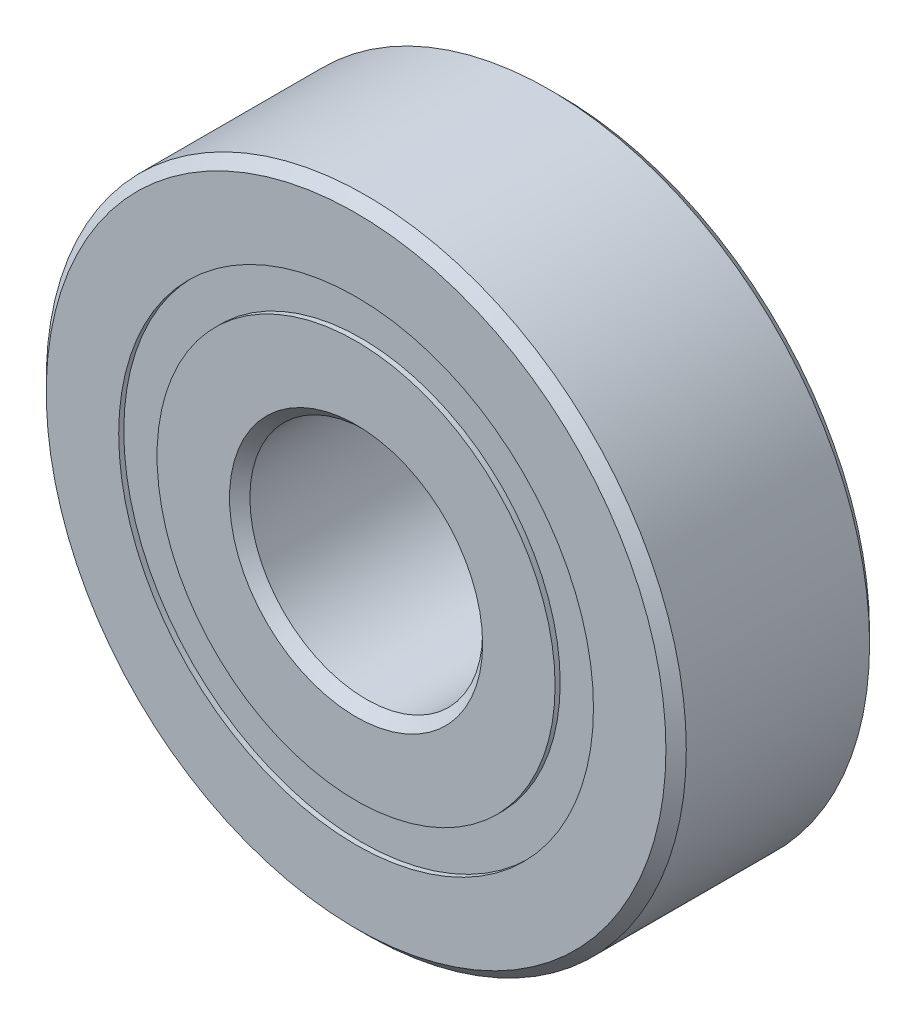
ISO-10303-21;
HEADER;
FILE_DESCRIPTION(('STEP AP214'),'2;1');
FILE_NAME('part.step','',(''),(''),'','','');
FILE_SCHEMA(('AUTOMOTIVE_DESIGN { 1 0 10303 214 1 1 1 1 }'));
ENDSEC;
DATA;
#1=APPLICATION_CONTEXT('core data for automotive mechanical design processes');
#2=APPLICATION_PROTOCOL_DEFINITION('international standard','automotive_design',2000,#1);
#3=PRODUCT_CONTEXT('',#1,'mechanical');
#4=PRODUCT('Part','Part','',(#3));
#5=PRODUCT_RELATED_PRODUCT_CATEGORY('part','',(#4));
#6=PRODUCT_DEFINITION_FORMATION('','',#4);
#7=PRODUCT_DEFINITION_CONTEXT('part definition',#1,'design');
#8=PRODUCT_DEFINITION('design','',#6,#7);
#9=PRODUCT_DEFINITION_SHAPE('','',#8);
#10=(LENGTH_UNIT() NAMED_UNIT(*) SI_UNIT(.MILLI.,.METRE.));
#11=(NAMED_UNIT(*) PLANE_ANGLE_UNIT() SI_UNIT($,.RADIAN.));
#12=(NAMED_UNIT(*) SI_UNIT($,.STERADIAN.) SOLID_ANGLE_UNIT());
#13=UNCERTAINTY_MEASURE_WITH_UNIT(LENGTH_MEASURE(1.E-05),#10,'distance_accuracy_value','');
#14=(GEOMETRIC_REPRESENTATION_CONTEXT(3) GLOBAL_UNCERTAINTY_ASSIGNED_CONTEXT((#13)) GLOBAL_UNIT_ASSIGNED_CONTEXT((#10,
#11,#12)) REPRESENTATION_CONTEXT('',''));
#15=CARTESIAN_POINT('',(0.,0.,0.));
#16=DIRECTION('',(0.,0.,1.));
#17=DIRECTION('',(1.,0.,0.));
#18=AXIS2_PLACEMENT_3D('',#15,#16,#17);
#19=CARTESIAN_POINT('',(0.,8.15934065934065,-3.32500000000002));
#20=DIRECTION('',(0.,0.,1.));
#21=DIRECTION('',(1.,0.,0.));
#22=AXIS2_PLACEMENT_3D('',#19,#20,#21);
#23=PLANE('',#22);
#24=CARTESIAN_POINT('',(0.,0.,-3.32500000000008));
#25=DIRECTION('',(0.,0.,1.));
#26=DIRECTION('',(1.,0.,0.));
#27=AXIS2_PLACEMENT_3D('',#24,#25,#26);
#28=CIRCLE('',#27,8.15934065934066);
#29=CARTESIAN_POINT('',(8.15934065934063,0.,-3.32500000000008));
#30=VERTEX_POINT('',#29);
#31=EDGE_CURVE('E57',#30,#30,#28,.T.);
#32=ORIENTED_EDGE('',*,*,#31,.F.);
#33=EDGE_LOOP('',(#32));
#34=FACE_BOUND('',#33,.T.);
#35=CARTESIAN_POINT('',(0.,0.,-3.32500000000008));
#36=DIRECTION('',(0.,0.,1.));
#37=DIRECTION('',(1.,0.,0.));
#38=AXIS2_PLACEMENT_3D('',#35,#36,#37);
#39=CIRCLE('',#38,6.84065934065934);
#40=CARTESIAN_POINT('',(6.84065934065931,0.,-3.32500000000008));
#41=VERTEX_POINT('',#40);
#42=EDGE_CURVE('E11',#41,#41,#39,.T.);
#43=ORIENTED_EDGE('',*,*,#42,.T.);
#44=EDGE_LOOP('',(#43));
#45=FACE_BOUND('',#44,.T.);
#46=ADVANCED_FACE('F43',(#34,#45),#23,.F.);
#47=CARTESIAN_POINT('',(0.,0.,3.5));
#48=DIRECTION('',(0.,0.,1.));
#49=DIRECTION('',(1.,0.,0.));
#50=AXIS2_PLACEMENT_3D('',#47,#48,#49);
#51=CYLINDRICAL_SURFACE('',#50,6.84065934065934);
#52=ORIENTED_EDGE('',*,*,#42,.F.);
#53=EDGE_LOOP('',(#52));
#54=FACE_BOUND('',#53,.T.);
#55=CARTESIAN_POINT('',(0.,0.,-1.68952158656807));
#56=DIRECTION('',(0.,0.,1.));
#57=DIRECTION('',(1.,0.,0.));
#58=AXIS2_PLACEMENT_3D('',#55,#56,#57);
#59=CIRCLE('',#58,6.84065934065934);
#60=CARTESIAN_POINT('',(6.84065934065928,0.,-1.68952158656807));
#61=VERTEX_POINT('',#60);
#62=EDGE_CURVE('E49',#61,#61,#59,.T.);
#63=ORIENTED_EDGE('',*,*,#62,.T.);
#64=EDGE_LOOP('',(#63));
#65=FACE_BOUND('',#64,.T.);
#66=ADVANCED_FACE('F66',(#54,#65),#51,.F.);
#67=CARTESIAN_POINT('',(0.,8.15934065934065,-1.6895215865681));
#68=DIRECTION('',(0.,0.,-1.));
#69=DIRECTION('',(-1.,0.,0.));
#70=AXIS2_PLACEMENT_3D('',#67,#68,#69);
#71=PLANE('',#70);
#72=ORIENTED_EDGE('',*,*,#62,.F.);
#73=EDGE_LOOP('',(#72));
#74=FACE_BOUND('',#73,.T.);
#75=CARTESIAN_POINT('',(0.,0.,-1.68952158656807));
#76=DIRECTION('',(0.,0.,1.));
#77=DIRECTION('',(1.,0.,0.));
#78=AXIS2_PLACEMENT_3D('',#75,#76,#77);
#79=CIRCLE('',#78,8.15934065934066);
#80=CARTESIAN_POINT('',(8.1593406593406,0.,-1.68952158656807));
#81=VERTEX_POINT('',#80);
#82=EDGE_CURVE('E53',#81,#81,#79,.T.);
#83=ORIENTED_EDGE('',*,*,#82,.T.);
#84=EDGE_LOOP('',(#83));
#85=FACE_BOUND('',#84,.T.);
#86=ADVANCED_FACE('F70',(#74,#85),#71,.F.);
#87=CARTESIAN_POINT('',(0.,0.,3.5));
#88=DIRECTION('',(0.,0.,1.));
#89=DIRECTION('',(1.,0.,0.));
#90=AXIS2_PLACEMENT_3D('',#87,#88,#89);
#91=CYLINDRICAL_SURFACE('',#90,8.15934065934066);
#92=ORIENTED_EDGE('',*,*,#82,.F.);
#93=EDGE_LOOP('',(#92));
#94=FACE_BOUND('',#93,.T.);
#95=ORIENTED_EDGE('',*,*,#31,.T.);
#96=EDGE_LOOP('',(#95));
#97=FACE_BOUND('',#96,.T.);
#98=ADVANCED_FACE('F63',(#94,#97),#91,.T.);
#99=CLOSED_SHELL('',(#46,#66,#86,#98));
#100=MANIFOLD_SOLID_BREP('B2',#99);
#101=CARTESIAN_POINT('',(0.,8.15934065934065,3.32499999999999));
#102=DIRECTION('',(0.,0.,-1.));
#103=DIRECTION('',(-1.,0.,0.));
#104=AXIS2_PLACEMENT_3D('',#101,#102,#103);
#105=PLANE('',#104);
#106=CARTESIAN_POINT('',(0.,0.,3.32499999999999));
#107=DIRECTION('',(0.,0.,1.));
#108=DIRECTION('',(1.,0.,0.));
#109=AXIS2_PLACEMENT_3D('',#106,#107,#108);
#110=CIRCLE('',#109,6.84065934065934);
#111=CARTESIAN_POINT('',(6.84065934065934,0.,3.32499999999999));
#112=VERTEX_POINT('',#111);
#113=EDGE_CURVE('E42',#112,#112,#110,.T.);
#114=ORIENTED_EDGE('',*,*,#113,.F.);
#115=EDGE_LOOP('',(#114));
#116=FACE_BOUND('',#115,.T.);
#117=CARTESIAN_POINT('',(0.,0.,3.32499999999999));
#118=DIRECTION('',(0.,0.,1.));
#119=DIRECTION('',(1.,0.,0.));
#120=AXIS2_PLACEMENT_3D('',#117,#118,#119);
#121=CIRCLE('',#120,8.15934065934066);
#122=CARTESIAN_POINT('',(8.15934065934066,0.,3.32499999999999));
#123=VERTEX_POINT('',#122);
#124=EDGE_CURVE('E124',#123,#123,#121,.T.);
#125=ORIENTED_EDGE('',*,*,#124,.T.);
#126=EDGE_LOOP('',(#125));
#127=FACE_BOUND('',#126,.T.);
#128=ADVANCED_FACE('F110',(#116,#127),#105,.F.);
#129=CARTESIAN_POINT('',(0.,0.,3.5));
#130=DIRECTION('',(0.,0.,1.));
#131=DIRECTION('',(1.,0.,0.));
#132=AXIS2_PLACEMENT_3D('',#129,#130,#131);
#133=CYLINDRICAL_SURFACE('',#132,6.84065934065934);
#134=CARTESIAN_POINT('',(0.,0.,1.68952158656807));
#135=DIRECTION('',(0.,0.,1.));
#136=DIRECTION('',(1.,0.,0.));
#137=AXIS2_PLACEMENT_3D('',#134,#135,#136);
#138=CIRCLE('',#137,6.84065934065934);
#139=CARTESIAN_POINT('',(6.84065934065934,0.,1.68952158656807));
#140=VERTEX_POINT('',#139);
#141=EDGE_CURVE('E116',#140,#140,#138,.T.);
#142=ORIENTED_EDGE('',*,*,#141,.F.);
#143=EDGE_LOOP('',(#142));
#144=FACE_BOUND('',#143,.T.);
#145=ORIENTED_EDGE('',*,*,#113,.T.);
#146=EDGE_LOOP('',(#145));
#147=FACE_BOUND('',#146,.T.);
#148=ADVANCED_FACE('F139',(#144,#147),#133,.F.);
#149=CARTESIAN_POINT('',(0.,8.15934065934065,1.68952158656807));
#150=DIRECTION('',(0.,0.,1.));
#151=DIRECTION('',(1.,0.,0.));
#152=AXIS2_PLACEMENT_3D('',#149,#150,#151);
#153=PLANE('',#152);
#154=CARTESIAN_POINT('',(0.,0.,1.68952158656807));
#155=DIRECTION('',(0.,0.,1.));
#156=DIRECTION('',(1.,0.,0.));
#157=AXIS2_PLACEMENT_3D('',#154,#155,#156);
#158=CIRCLE('',#157,8.15934065934066);
#159=CARTESIAN_POINT('',(8.15934065934066,0.,1.68952158656807));
#160=VERTEX_POINT('',#159);
#161=EDGE_CURVE('E120',#160,#160,#158,.T.);
#162=ORIENTED_EDGE('',*,*,#161,.F.);
#163=EDGE_LOOP('',(#162));
#164=FACE_BOUND('',#163,.T.);
#165=ORIENTED_EDGE('',*,*,#141,.T.);
#166=EDGE_LOOP('',(#165));
#167=FACE_BOUND('',#166,.T.);
#168=ADVANCED_FACE('F134',(#164,#167),#153,.F.);
#169=CARTESIAN_POINT('',(0.,0.,3.5));
#170=DIRECTION('',(0.,0.,1.));
#171=DIRECTION('',(1.,0.,0.));
#172=AXIS2_PLACEMENT_3D('',#169,#170,#171);
#173=CYLINDRICAL_SURFACE('',#172,8.15934065934066);
#174=ORIENTED_EDGE('',*,*,#124,.F.);
#175=EDGE_LOOP('',(#174));
#176=FACE_BOUND('',#175,.T.);
#177=ORIENTED_EDGE('',*,*,#161,.T.);
#178=EDGE_LOOP('',(#177));
#179=FACE_BOUND('',#178,.T.);
#180=ADVANCED_FACE('F131',(#176,#179),#173,.T.);
#181=CLOSED_SHELL('',(#128,#148,#168,#180));
#182=MANIFOLD_SOLID_BREP('B6',#181);
#183=CARTESIAN_POINT('',(-3.74999999999989,6.49519052838332,0.));
#184=DIRECTION('',(0.,0.,1.));
#185=DIRECTION('',(-0.499999999999989,0.866025403784445,0.));
#186=AXIS2_PLACEMENT_3D('',#183,#184,#185);
#187=SPHERICAL_SURFACE('',#186,1.68952158656808);
#188=CARTESIAN_POINT('',(-3.74999999999989,6.49519052838332,1.68952158656805));
#189=VERTEX_POINT('',#188);
#190=VERTEX_LOOP('',#189);
#191=FACE_BOUND('',#190,.T.);
#192=ADVANCED_FACE('F177',(#191),#187,.T.);
#193=CLOSED_SHELL('',(#192));
#194=MANIFOLD_SOLID_BREP('B37',#193);
#195=CARTESIAN_POINT('',(-6.49519052838327,3.75000000000009,0.));
#196=DIRECTION('',(0.,0.,1.));
#197=DIRECTION('',(-0.866025403784433,0.50000000000001,0.));
#198=AXIS2_PLACEMENT_3D('',#195,#196,#197);
#199=SPHERICAL_SURFACE('',#198,1.68952158656808);
#200=CARTESIAN_POINT('',(-6.49519052838327,3.75000000000009,1.68952158656805));
#201=VERTEX_POINT('',#200);
#202=VERTEX_LOOP('',#201);
#203=FACE_BOUND('',#202,.T.);
#204=ADVANCED_FACE('F197',(#203),#199,.T.);
#205=CLOSED_SHELL('',(#204));
#206=MANIFOLD_SOLID_BREP('B106',#205);
#207=CARTESIAN_POINT('',(-7.50000000000003,1.11022302462516E-13,0.));
#208=DIRECTION('',(0.,0.,1.));
#209=DIRECTION('',(-1.,0.,0.));
#210=AXIS2_PLACEMENT_3D('',#207,#208,#209);
#211=SPHERICAL_SURFACE('',#210,1.68952158656808);
#212=CARTESIAN_POINT('',(-7.50000000000003,1.11022302462516E-13,1.68952158656805));
#213=VERTEX_POINT('',#212);
#214=VERTEX_LOOP('',#213);
#215=FACE_BOUND('',#214,.T.);
#216=ADVANCED_FACE('F217',(#215),#211,.T.);
#217=CLOSED_SHELL('',(#216));
#218=MANIFOLD_SOLID_BREP('B173',#217);
#219=CARTESIAN_POINT('',(-6.49519052838332,-3.74999999999992,0.));
#220=DIRECTION('',(0.,0.,1.));
#221=DIRECTION('',(-0.866025403784443,-0.499999999999992,0.));
#222=AXIS2_PLACEMENT_3D('',#219,#220,#221);
#223=SPHERICAL_SURFACE('',#222,1.68952158656808);
#224=CARTESIAN_POINT('',(-6.49519052838332,-3.74999999999992,1.68952158656808));
#225=VERTEX_POINT('',#224);
#226=VERTEX_LOOP('',#225);
#227=FACE_BOUND('',#226,.T.);
#228=ADVANCED_FACE('F237',(#227),#223,.T.);
#229=CLOSED_SHELL('',(#228));
#230=MANIFOLD_SOLID_BREP('B193',#229);
#231=CARTESIAN_POINT('',(-3.75000000000009,-6.49519052838321,0.));
#232=DIRECTION('',(0.,0.,1.));
#233=DIRECTION('',(-0.500000000000007,-0.866025403784435,0.));
#234=AXIS2_PLACEMENT_3D('',#231,#232,#233);
#235=SPHERICAL_SURFACE('',#234,1.68952158656808);
#236=CARTESIAN_POINT('',(-3.75000000000009,-6.49519052838321,1.68952158656808));
#237=VERTEX_POINT('',#236);
#238=VERTEX_LOOP('',#237);
#239=FACE_BOUND('',#238,.T.);
#240=ADVANCED_FACE('F257',(#239),#235,.T.);
#241=CLOSED_SHELL('',(#240));
#242=MANIFOLD_SOLID_BREP('B213',#241);
#243=CARTESIAN_POINT('',(0.,-7.50000000000001,0.));
#244=DIRECTION('',(0.,0.,1.));
#245=DIRECTION('',(0.,-1.,0.));
#246=AXIS2_PLACEMENT_3D('',#243,#244,#245);
#247=SPHERICAL_SURFACE('',#246,1.68952158656808);
#248=CARTESIAN_POINT('',(0.,-7.50000000000001,1.68952158656805));
#249=VERTEX_POINT('',#248);
#250=VERTEX_LOOP('',#249);
#251=FACE_BOUND('',#250,.T.);
#252=ADVANCED_FACE('F277',(#251),#247,.T.);
#253=CLOSED_SHELL('',(#252));
#254=MANIFOLD_SOLID_BREP('B233',#253);
#255=CARTESIAN_POINT('',(3.74999999999998,-6.49519052838332,0.));
#256=DIRECTION('',(0.,0.,1.));
#257=DIRECTION('',(0.499999999999995,-0.866025403784441,0.));
#258=AXIS2_PLACEMENT_3D('',#255,#256,#257);
#259=SPHERICAL_SURFACE('',#258,1.68952158656808);
#260=CARTESIAN_POINT('',(3.74999999999998,-6.49519052838332,1.68952158656805));
#261=VERTEX_POINT('',#260);
#262=VERTEX_LOOP('',#261);
#263=FACE_BOUND('',#262,.T.);
#264=ADVANCED_FACE('F297',(#263),#259,.T.);
#265=CLOSED_SHELL('',(#264));
#266=MANIFOLD_SOLID_BREP('B253',#265);
#267=CARTESIAN_POINT('',(6.49519052838327,-3.75000000000003,0.));
#268=DIRECTION('',(0.,0.,1.));
#269=DIRECTION('',(0.866025403784436,-0.500000000000004,0.));
#270=AXIS2_PLACEMENT_3D('',#267,#268,#269);
#271=SPHERICAL_SURFACE('',#270,1.68952158656808);
#272=CARTESIAN_POINT('',(6.49519052838327,-3.75000000000003,1.68952158656808));
#273=VERTEX_POINT('',#272);
#274=VERTEX_LOOP('',#273);
#275=FACE_BOUND('',#274,.T.);
#276=ADVANCED_FACE('F317',(#275),#271,.T.);
#277=CLOSED_SHELL('',(#276));
#278=MANIFOLD_SOLID_BREP('B273',#277);
#279=CARTESIAN_POINT('',(7.50000000000001,0.,0.));
#280=DIRECTION('',(0.,0.,1.));
#281=DIRECTION('',(1.,0.,0.));
#282=AXIS2_PLACEMENT_3D('',#279,#280,#281);
#283=SPHERICAL_SURFACE('',#282,1.68952158656808);
#284=CARTESIAN_POINT('',(7.50000000000001,0.,1.68952158656808));
#285=VERTEX_POINT('',#284);
#286=VERTEX_LOOP('',#285);
#287=FACE_BOUND('',#286,.T.);
#288=ADVANCED_FACE('F337',(#287),#283,.T.);
#289=CLOSED_SHELL('',(#288));
#290=MANIFOLD_SOLID_BREP('B293',#289);
#291=CARTESIAN_POINT('',(6.49519052838332,3.75000000000003,0.));
#292=DIRECTION('',(0.,0.,1.));
#293=DIRECTION('',(0.86602540378444,0.499999999999998,0.));
#294=AXIS2_PLACEMENT_3D('',#291,#292,#293);
#295=SPHERICAL_SURFACE('',#294,1.68952158656808);
#296=CARTESIAN_POINT('',(6.49519052838332,3.75000000000003,1.68952158656805));
#297=VERTEX_POINT('',#296);
#298=VERTEX_LOOP('',#297);
#299=FACE_BOUND('',#298,.T.);
#300=ADVANCED_FACE('F357',(#299),#295,.T.);
#301=CLOSED_SHELL('',(#300));
#302=MANIFOLD_SOLID_BREP('B313',#301);
#303=CARTESIAN_POINT('',(3.75000000000003,6.49519052838332,0.));
#304=DIRECTION('',(0.,0.,1.));
#305=DIRECTION('',(0.500000000000001,0.866025403784438,0.));
#306=AXIS2_PLACEMENT_3D('',#303,#304,#305);
#307=SPHERICAL_SURFACE('',#306,1.68952158656808);
#308=CARTESIAN_POINT('',(3.75000000000003,6.49519052838332,1.68952158656805));
#309=VERTEX_POINT('',#308);
#310=VERTEX_LOOP('',#309);
#311=FACE_BOUND('',#310,.T.);
#312=ADVANCED_FACE('F377',(#311),#307,.T.);
#313=CLOSED_SHELL('',(#312));
#314=MANIFOLD_SOLID_BREP('B333',#313);
#315=CARTESIAN_POINT('',(0.,7.50000000000001,0.));
#316=DIRECTION('',(0.,0.,1.));
#317=DIRECTION('',(0.,1.,0.));
#318=AXIS2_PLACEMENT_3D('',#315,#316,#317);
#319=SPHERICAL_SURFACE('',#318,1.68952158656808);
#320=CARTESIAN_POINT('',(0.,7.50000000000001,1.68952158656808));
#321=VERTEX_POINT('',#320);
#322=VERTEX_LOOP('',#321);
#323=FACE_BOUND('',#322,.T.);
#324=ADVANCED_FACE('F399',(#323),#319,.T.);
#325=CLOSED_SHELL('',(#324));
#326=MANIFOLD_SOLID_BREP('B353',#325);
#327=CARTESIAN_POINT('',(0.,6.84065934065936,3.49999999999998));
#328=DIRECTION('',(0.,0.,-1.));
#329=DIRECTION('',(-1.,0.,0.));
#330=AXIS2_PLACEMENT_3D('',#327,#328,#329);
#331=PLANE('',#330);
#332=CARTESIAN_POINT('',(0.,0.,3.5));
#333=DIRECTION('',(0.,0.,1.));
#334=DIRECTION('',(1.,0.,0.));
#335=AXIS2_PLACEMENT_3D('',#332,#333,#334);
#336=CIRCLE('',#335,4.35);
#337=CARTESIAN_POINT('',(4.35,0.,3.5));
#338=VERTEX_POINT('',#337);
#339=EDGE_CURVE('E446',#338,#338,#336,.T.);
#340=ORIENTED_EDGE('',*,*,#339,.F.);
#341=EDGE_LOOP('',(#340));
#342=FACE_BOUND('',#341,.T.);
#343=CARTESIAN_POINT('',(0.,0.,3.5));
#344=DIRECTION('',(0.,0.,1.));
#345=DIRECTION('',(1.,0.,0.));
#346=AXIS2_PLACEMENT_3D('',#343,#344,#345);
#347=CIRCLE('',#346,6.84065934065934);
#348=CARTESIAN_POINT('',(6.84065934065934,0.,3.5));
#349=VERTEX_POINT('',#348);
#350=EDGE_CURVE('E398',#349,#349,#347,.T.);
#351=ORIENTED_EDGE('',*,*,#350,.T.);
#352=EDGE_LOOP('',(#351));
#353=FACE_BOUND('',#352,.T.);
#354=ADVANCED_FACE('F418',(#342,#353),#331,.F.);
#355=CARTESIAN_POINT('',(0.,0.,3.5));
#356=DIRECTION('',(0.,0.,1.));
#357=DIRECTION('',(1.,0.,0.));
#358=AXIS2_PLACEMENT_3D('',#355,#356,#357);
#359=CYLINDRICAL_SURFACE('',#358,6.84065934065934);
#360=ORIENTED_EDGE('',*,*,#350,.F.);
#361=EDGE_LOOP('',(#360));
#362=FACE_BOUND('',#361,.T.);
#363=CARTESIAN_POINT('',(0.,0.,1.55555555555556));
#364=DIRECTION('',(0.,0.,1.));
#365=DIRECTION('',(1.,0.,0.));
#366=AXIS2_PLACEMENT_3D('',#363,#364,#365);
#367=CIRCLE('',#366,6.84065934065934);
#368=CARTESIAN_POINT('',(6.84065934065934,0.,1.55555555555556));
#369=VERTEX_POINT('',#368);
#370=EDGE_CURVE('E424',#369,#369,#367,.T.);
#371=ORIENTED_EDGE('',*,*,#370,.T.);
#372=EDGE_LOOP('',(#371));
#373=FACE_BOUND('',#372,.T.);
#374=ADVANCED_FACE('F453',(#362,#373),#359,.T.);
#375=CARTESIAN_POINT('',(0.,0.,0.));
#376=DIRECTION('',(0.,0.,1.));
#377=DIRECTION('',(1.,0.,0.));
#378=AXIS2_PLACEMENT_3D('',#375,#376,#377);
#379=TOROIDAL_SURFACE('',#378,7.49999999999999,1.68952158656808);
#380=ORIENTED_EDGE('',*,*,#370,.F.);
#381=EDGE_LOOP('',(#380));
#382=FACE_BOUND('',#381,.T.);
#383=CARTESIAN_POINT('',(0.,0.,-1.55555555555556));
#384=DIRECTION('',(0.,0.,1.));
#385=DIRECTION('',(1.,0.,0.));
#386=AXIS2_PLACEMENT_3D('',#383,#384,#385);
#387=CIRCLE('',#386,6.84065934065934);
#388=CARTESIAN_POINT('',(6.84065934065928,0.,-1.55555555555556));
#389=VERTEX_POINT('',#388);
#390=EDGE_CURVE('E428',#389,#389,#387,.T.);
#391=ORIENTED_EDGE('',*,*,#390,.T.);
#392=EDGE_LOOP('',(#391));
#393=FACE_BOUND('',#392,.T.);
#394=ADVANCED_FACE('F457',(#382,#393),#379,.F.);
#395=CARTESIAN_POINT('',(0.,0.,3.5));
#396=DIRECTION('',(0.,0.,1.));
#397=DIRECTION('',(1.,0.,0.));
#398=AXIS2_PLACEMENT_3D('',#395,#396,#397);
#399=CYLINDRICAL_SURFACE('',#398,6.84065934065934);
#400=ORIENTED_EDGE('',*,*,#390,.F.);
#401=EDGE_LOOP('',(#400));
#402=FACE_BOUND('',#401,.T.);
#403=CARTESIAN_POINT('',(0.,0.,-3.50000000000006));
#404=DIRECTION('',(0.,0.,1.));
#405=DIRECTION('',(1.,0.,0.));
#406=AXIS2_PLACEMENT_3D('',#403,#404,#405);
#407=CIRCLE('',#406,6.84065934065934);
#408=CARTESIAN_POINT('',(6.84065934065931,0.,-3.50000000000006));
#409=VERTEX_POINT('',#408);
#410=EDGE_CURVE('E432',#409,#409,#407,.T.);
#411=ORIENTED_EDGE('',*,*,#410,.T.);
#412=EDGE_LOOP('',(#411));
#413=FACE_BOUND('',#412,.T.);
#414=ADVANCED_FACE('F462',(#402,#413),#399,.T.);
#415=CARTESIAN_POINT('',(0.,4.35000000000002,-3.5));
#416=DIRECTION('',(0.,0.,1.));
#417=DIRECTION('',(1.,0.,0.));
#418=AXIS2_PLACEMENT_3D('',#415,#416,#417);
#419=PLANE('',#418);
#420=ORIENTED_EDGE('',*,*,#410,.F.);
#421=EDGE_LOOP('',(#420));
#422=FACE_BOUND('',#421,.T.);
#423=CARTESIAN_POINT('',(0.,0.,-3.50000000000006));
#424=DIRECTION('',(0.,0.,1.));
#425=DIRECTION('',(1.,0.,0.));
#426=AXIS2_PLACEMENT_3D('',#423,#424,#425);
#427=CIRCLE('',#426,4.35);
#428=CARTESIAN_POINT('',(4.34999999999997,0.,-3.50000000000006));
#429=VERTEX_POINT('',#428);
#430=EDGE_CURVE('E437',#429,#429,#427,.T.);
#431=ORIENTED_EDGE('',*,*,#430,.T.);
#432=EDGE_LOOP('',(#431));
#433=FACE_BOUND('',#432,.T.);
#434=ADVANCED_FACE('F468',(#422,#433),#419,.F.);
#435=CARTESIAN_POINT('',(0.,0.,-3.15000000000004));
#436=DIRECTION('',(0.,0.,-1.));
#437=DIRECTION('',(-1.,0.,0.));
#438=AXIS2_PLACEMENT_3D('',#435,#436,#437);
#439=CONICAL_SURFACE('',#438,4.,0.78539816339745);
#440=ORIENTED_EDGE('',*,*,#430,.F.);
#441=EDGE_LOOP('',(#440));
#442=FACE_BOUND('',#441,.T.);
#443=CARTESIAN_POINT('',(0.,0.,-3.15000000000004));
#444=DIRECTION('',(0.,0.,1.));
#445=DIRECTION('',(1.,0.,0.));
#446=AXIS2_PLACEMENT_3D('',#443,#444,#445);
#447=CIRCLE('',#446,4.);
#448=CARTESIAN_POINT('',(3.99999999999997,0.,-3.15000000000004));
#449=VERTEX_POINT('',#448);
#450=EDGE_CURVE('E440',#449,#449,#447,.T.);
#451=ORIENTED_EDGE('',*,*,#450,.T.);
#452=EDGE_LOOP('',(#451));
#453=FACE_BOUND('',#452,.T.);
#454=ADVANCED_FACE('F472',(#442,#453),#439,.F.);
#455=CARTESIAN_POINT('',(0.,0.,3.5));
#456=DIRECTION('',(0.,0.,1.));
#457=DIRECTION('',(1.,0.,0.));
#458=AXIS2_PLACEMENT_3D('',#455,#456,#457);
#459=CYLINDRICAL_SURFACE('',#458,4.);
#460=ORIENTED_EDGE('',*,*,#450,.F.);
#461=EDGE_LOOP('',(#460));
#462=FACE_BOUND('',#461,.T.);
#463=CARTESIAN_POINT('',(0.,0.,3.15000000000001));
#464=DIRECTION('',(0.,0.,1.));
#465=DIRECTION('',(1.,0.,0.));
#466=AXIS2_PLACEMENT_3D('',#463,#464,#465);
#467=CIRCLE('',#466,4.);
#468=CARTESIAN_POINT('',(4.,0.,3.15000000000001));
#469=VERTEX_POINT('',#468);
#470=EDGE_CURVE('E443',#469,#469,#467,.T.);
#471=ORIENTED_EDGE('',*,*,#470,.T.);
#472=EDGE_LOOP('',(#471));
#473=FACE_BOUND('',#472,.T.);
#474=ADVANCED_FACE('F476',(#462,#473),#459,.F.);
#475=CARTESIAN_POINT('',(0.,0.,3.5));
#476=DIRECTION('',(0.,0.,1.));
#477=DIRECTION('',(1.,0.,0.));
#478=AXIS2_PLACEMENT_3D('',#475,#476,#477);
#479=CONICAL_SURFACE('',#478,4.35,0.785398163397448);
#480=ORIENTED_EDGE('',*,*,#470,.F.);
#481=EDGE_LOOP('',(#480));
#482=FACE_BOUND('',#481,.T.);
#483=ORIENTED_EDGE('',*,*,#339,.T.);
#484=EDGE_LOOP('',(#483));
#485=FACE_BOUND('',#484,.T.);
#486=ADVANCED_FACE('F450',(#482,#485),#479,.F.);
#487=CLOSED_SHELL('',(#354,#374,#394,#414,#434,#454,#474,#486));
#488=MANIFOLD_SOLID_BREP('B373',#487);
#489=CARTESIAN_POINT('',(0.,0.,3.15000000000001));
#490=DIRECTION('',(0.,0.,-1.));
#491=DIRECTION('',(-1.,0.,0.));
#492=AXIS2_PLACEMENT_3D('',#489,#490,#491);
#493=CONICAL_SURFACE('',#492,11.,0.785398163397448);
#494=CARTESIAN_POINT('',(0.,0.,3.5));
#495=DIRECTION('',(0.,0.,1.));
#496=DIRECTION('',(1.,0.,0.));
#497=AXIS2_PLACEMENT_3D('',#494,#495,#496);
#498=CIRCLE('',#497,10.65);
#499=CARTESIAN_POINT('',(10.65,0.,3.5));
#500=VERTEX_POINT('',#499);
#501=EDGE_CURVE('E567',#500,#500,#498,.T.);
#502=ORIENTED_EDGE('',*,*,#501,.F.);
#503=EDGE_LOOP('',(#502));
#504=FACE_BOUND('',#503,.T.);
#505=CARTESIAN_POINT('',(0.,0.,3.15000000000001));
#506=DIRECTION('',(0.,0.,1.));
#507=DIRECTION('',(1.,0.,0.));
#508=AXIS2_PLACEMENT_3D('',#505,#506,#507);
#509=CIRCLE('',#508,11.);
#510=CARTESIAN_POINT('',(11.,0.,3.15000000000001));
#511=VERTEX_POINT('',#510);
#512=EDGE_CURVE('E417',#511,#511,#509,.T.);
#513=ORIENTED_EDGE('',*,*,#512,.T.);
#514=EDGE_LOOP('',(#513));
#515=FACE_BOUND('',#514,.T.);
#516=ADVANCED_FACE('F539',(#504,#515),#493,.T.);
#517=CARTESIAN_POINT('',(0.,0.,3.5));
#518=DIRECTION('',(0.,0.,1.));
#519=DIRECTION('',(1.,0.,0.));
#520=AXIS2_PLACEMENT_3D('',#517,#518,#519);
#521=CYLINDRICAL_SURFACE('',#520,11.);
#522=ORIENTED_EDGE('',*,*,#512,.F.);
#523=EDGE_LOOP('',(#522));
#524=FACE_BOUND('',#523,.T.);
#525=CARTESIAN_POINT('',(0.,0.,-3.15000000000004));
#526=DIRECTION('',(0.,0.,1.));
#527=DIRECTION('',(1.,0.,0.));
#528=AXIS2_PLACEMENT_3D('',#525,#526,#527);
#529=CIRCLE('',#528,11.);
#530=CARTESIAN_POINT('',(11.,0.,-3.15000000000004));
#531=VERTEX_POINT('',#530);
#532=EDGE_CURVE('E545',#531,#531,#529,.T.);
#533=ORIENTED_EDGE('',*,*,#532,.T.);
#534=EDGE_LOOP('',(#533));
#535=FACE_BOUND('',#534,.T.);
#536=ADVANCED_FACE('F574',(#524,#535),#521,.T.);
#537=CARTESIAN_POINT('',(0.,0.,-3.50000000000006));
#538=DIRECTION('',(0.,0.,1.));
#539=DIRECTION('',(1.,0.,0.));
#540=AXIS2_PLACEMENT_3D('',#537,#538,#539);
#541=CONICAL_SURFACE('',#540,10.65,0.785398163397448);
#542=ORIENTED_EDGE('',*,*,#532,.F.);
#543=EDGE_LOOP('',(#542));
#544=FACE_BOUND('',#543,.T.);
#545=CARTESIAN_POINT('',(0.,0.,-3.50000000000006));
#546=DIRECTION('',(0.,0.,1.));
#547=DIRECTION('',(1.,0.,0.));
#548=AXIS2_PLACEMENT_3D('',#545,#546,#547);
#549=CIRCLE('',#548,10.65);
#550=CARTESIAN_POINT('',(10.65,0.,-3.50000000000006));
#551=VERTEX_POINT('',#550);
#552=EDGE_CURVE('E549',#551,#551,#549,.T.);
#553=ORIENTED_EDGE('',*,*,#552,.T.);
#554=EDGE_LOOP('',(#553));
#555=FACE_BOUND('',#554,.T.);
#556=ADVANCED_FACE('F578',(#544,#555),#541,.T.);
#557=CARTESIAN_POINT('',(0.,10.65,-3.50000000000006));
#558=DIRECTION('',(0.,0.,1.));
#559=DIRECTION('',(1.,0.,0.));
#560=AXIS2_PLACEMENT_3D('',#557,#558,#559);
#561=PLANE('',#560);
#562=ORIENTED_EDGE('',*,*,#552,.F.);
#563=EDGE_LOOP('',(#562));
#564=FACE_BOUND('',#563,.T.);
#565=CARTESIAN_POINT('',(0.,0.,-3.50000000000006));
#566=DIRECTION('',(0.,0.,1.));
#567=DIRECTION('',(1.,0.,0.));
#568=AXIS2_PLACEMENT_3D('',#565,#566,#567);
#569=CIRCLE('',#568,8.15934065934066);
#570=CARTESIAN_POINT('',(8.15934065934063,0.,-3.50000000000006));
#571=VERTEX_POINT('',#570);
#572=EDGE_CURVE('E553',#571,#571,#569,.T.);
#573=ORIENTED_EDGE('',*,*,#572,.T.);
#574=EDGE_LOOP('',(#573));
#575=FACE_BOUND('',#574,.T.);
#576=ADVANCED_FACE('F583',(#564,#575),#561,.F.);
#577=CARTESIAN_POINT('',(0.,0.,3.5));
#578=DIRECTION('',(0.,0.,1.));
#579=DIRECTION('',(1.,0.,0.));
#580=AXIS2_PLACEMENT_3D('',#577,#578,#579);
#581=CYLINDRICAL_SURFACE('',#580,8.15934065934066);
#582=ORIENTED_EDGE('',*,*,#572,.F.);
#583=EDGE_LOOP('',(#582));
#584=FACE_BOUND('',#583,.T.);
#585=CARTESIAN_POINT('',(0.,0.,-1.55555555555556));
#586=DIRECTION('',(0.,0.,1.));
#587=DIRECTION('',(1.,0.,0.));
#588=AXIS2_PLACEMENT_3D('',#585,#586,#587);
#589=CIRCLE('',#588,8.15934065934066);
#590=CARTESIAN_POINT('',(8.1593406593406,0.,-1.55555555555556));
#591=VERTEX_POINT('',#590);
#592=EDGE_CURVE('E558',#591,#591,#589,.T.);
#593=ORIENTED_EDGE('',*,*,#592,.T.);
#594=EDGE_LOOP('',(#593));
#595=FACE_BOUND('',#594,.T.);
#596=ADVANCED_FACE('F589',(#584,#595),#581,.F.);
#597=CARTESIAN_POINT('',(0.,0.,0.));
#598=DIRECTION('',(0.,0.,1.));
#599=DIRECTION('',(1.,0.,0.));
#600=AXIS2_PLACEMENT_3D('',#597,#598,#599);
#601=TOROIDAL_SURFACE('',#600,7.5,1.68952158656808);
#602=ORIENTED_EDGE('',*,*,#592,.F.);
#603=EDGE_LOOP('',(#602));
#604=FACE_BOUND('',#603,.T.);
#605=CARTESIAN_POINT('',(0.,0.,1.55555555555556));
#606=DIRECTION('',(0.,0.,1.));
#607=DIRECTION('',(1.,0.,0.));
#608=AXIS2_PLACEMENT_3D('',#605,#606,#607);
#609=CIRCLE('',#608,8.15934065934066);
#610=CARTESIAN_POINT('',(8.15934065934066,0.,1.55555555555556));
#611=VERTEX_POINT('',#610);
#612=EDGE_CURVE('E561',#611,#611,#609,.T.);
#613=ORIENTED_EDGE('',*,*,#612,.T.);
#614=EDGE_LOOP('',(#613));
#615=FACE_BOUND('',#614,.T.);
#616=ADVANCED_FACE('F593',(#604,#615),#601,.F.);
#617=CARTESIAN_POINT('',(0.,0.,3.5));
#618=DIRECTION('',(0.,0.,1.));
#619=DIRECTION('',(1.,0.,0.));
#620=AXIS2_PLACEMENT_3D('',#617,#618,#619);
#621=CYLINDRICAL_SURFACE('',#620,8.15934065934066);
#622=ORIENTED_EDGE('',*,*,#612,.F.);
#623=EDGE_LOOP('',(#622));
#624=FACE_BOUND('',#623,.T.);
#625=CARTESIAN_POINT('',(0.,0.,3.5));
#626=DIRECTION('',(0.,0.,1.));
#627=DIRECTION('',(1.,0.,0.));
#628=AXIS2_PLACEMENT_3D('',#625,#626,#627);
#629=CIRCLE('',#628,8.15934065934066);
#630=CARTESIAN_POINT('',(8.15934065934066,0.,3.5));
#631=VERTEX_POINT('',#630);
#632=EDGE_CURVE('E564',#631,#631,#629,.T.);
#633=ORIENTED_EDGE('',*,*,#632,.T.);
#634=EDGE_LOOP('',(#633));
#635=FACE_BOUND('',#634,.T.);
#636=ADVANCED_FACE('F597',(#624,#635),#621,.F.);
#637=CARTESIAN_POINT('',(0.,10.65,3.5));
#638=DIRECTION('',(0.,0.,-1.));
#639=DIRECTION('',(-1.,0.,0.));
#640=AXIS2_PLACEMENT_3D('',#637,#638,#639);
#641=PLANE('',#640);
#642=ORIENTED_EDGE('',*,*,#632,.F.);
#643=EDGE_LOOP('',(#642));
#644=FACE_BOUND('',#643,.T.);
#645=ORIENTED_EDGE('',*,*,#501,.T.);
#646=EDGE_LOOP('',(#645));
#647=FACE_BOUND('',#646,.T.);
#648=ADVANCED_FACE('F571',(#644,#647),#641,.F.);
#649=CLOSED_SHELL('',(#516,#536,#556,#576,#596,#616,#636,#648));
#650=MANIFOLD_SOLID_BREP('B393',#649);
#651=ADVANCED_BREP_SHAPE_REPRESENTATION('',(#18,#100,#182,#194,#206,#218,#230,#242,#254,#266,
#278,#290,#302,#314,#326,#488,#650),#14);
#652=SHAPE_DEFINITION_REPRESENTATION(#9,#651);
ENDSEC;
END-ISO-10303-21;
